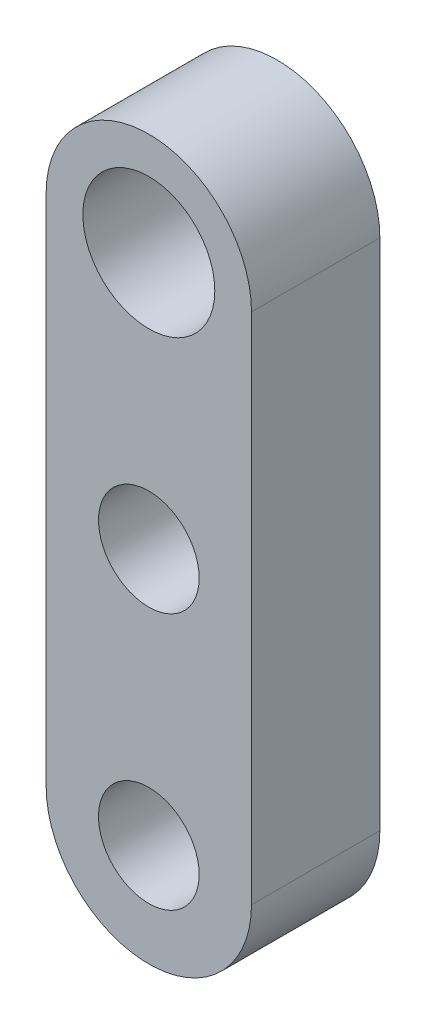
ISO-10303-21;
HEADER;
FILE_DESCRIPTION(('STEP AP214'),'2;1');
FILE_NAME('part.step','',(''),(''),'','','');
FILE_SCHEMA(('AUTOMOTIVE_DESIGN { 1 0 10303 214 1 1 1 1 }'));
ENDSEC;
DATA;
#1=APPLICATION_CONTEXT('core data for automotive mechanical design processes');
#2=APPLICATION_PROTOCOL_DEFINITION('international standard','automotive_design',2000,#1);
#3=PRODUCT_CONTEXT('',#1,'mechanical');
#4=PRODUCT('Part','Part','',(#3));
#5=PRODUCT_RELATED_PRODUCT_CATEGORY('part','',(#4));
#6=PRODUCT_DEFINITION_FORMATION('','',#4);
#7=PRODUCT_DEFINITION_CONTEXT('part definition',#1,'design');
#8=PRODUCT_DEFINITION('design','',#6,#7);
#9=PRODUCT_DEFINITION_SHAPE('','',#8);
#10=(LENGTH_UNIT() NAMED_UNIT(*) SI_UNIT(.MILLI.,.METRE.));
#11=(NAMED_UNIT(*) PLANE_ANGLE_UNIT() SI_UNIT($,.RADIAN.));
#12=(NAMED_UNIT(*) SI_UNIT($,.STERADIAN.) SOLID_ANGLE_UNIT());
#13=UNCERTAINTY_MEASURE_WITH_UNIT(LENGTH_MEASURE(1.E-05),#10,'distance_accuracy_value','');
#14=(GEOMETRIC_REPRESENTATION_CONTEXT(3) GLOBAL_UNCERTAINTY_ASSIGNED_CONTEXT((#13)) GLOBAL_UNIT_ASSIGNED_CONTEXT((#10,
#11,#12)) REPRESENTATION_CONTEXT('',''));
#15=CARTESIAN_POINT('',(0.,0.,0.));
#16=DIRECTION('',(0.,0.,1.));
#17=DIRECTION('',(1.,0.,0.));
#18=AXIS2_PLACEMENT_3D('',#15,#16,#17);
#19=CARTESIAN_POINT('',(60.6425000000078,0.,6.35));
#20=DIRECTION('',(-1.,0.,0.));
#21=DIRECTION('',(0.,-1.,0.));
#22=AXIS2_PLACEMENT_3D('',#19,#20,#21);
#23=PLANE('',#22);
#24=DIRECTION('',(0.,1.,0.));
#25=VECTOR('',#24,1.);
#26=CARTESIAN_POINT('',(60.6425000000078,0.,0.));
#27=LINE('',#26,#25);
#28=CARTESIAN_POINT('',(60.6425000000077,109.040413582038,0.));
#29=VERTEX_POINT('',#28);
#30=CARTESIAN_POINT('',(60.6425000000077,134.440413582038,0.));
#31=VERTEX_POINT('',#30);
#32=EDGE_CURVE('E123',#29,#31,#27,.T.);
#33=ORIENTED_EDGE('',*,*,#32,.T.);
#34=DIRECTION('',(0.,0.,-1.));
#35=VECTOR('',#34,1.);
#36=CARTESIAN_POINT('',(60.6425000000077,134.440413582038,6.35));
#37=LINE('',#36,#35);
#38=CARTESIAN_POINT('',(60.6425000000077,134.440413582038,6.35));
#39=VERTEX_POINT('',#38);
#40=EDGE_CURVE('E11',#39,#31,#37,.T.);
#41=ORIENTED_EDGE('',*,*,#40,.F.);
#42=DIRECTION('',(0.,1.,0.));
#43=VECTOR('',#42,1.);
#44=CARTESIAN_POINT('',(60.6425000000078,0.,6.35));
#45=LINE('',#44,#43);
#46=CARTESIAN_POINT('',(60.6425000000077,109.040413582038,6.35));
#47=VERTEX_POINT('',#46);
#48=EDGE_CURVE('E105',#47,#39,#45,.T.);
#49=ORIENTED_EDGE('',*,*,#48,.F.);
#50=DIRECTION('',(0.,0.,-1.));
#51=VECTOR('',#50,1.);
#52=CARTESIAN_POINT('',(60.6425000000077,109.040413582038,6.35));
#53=LINE('',#52,#51);
#54=EDGE_CURVE('E122',#47,#29,#53,.T.);
#55=ORIENTED_EDGE('',*,*,#54,.T.);
#56=EDGE_LOOP('',(#33,#41,#49,#55));
#57=FACE_BOUND('',#56,.T.);
#58=ADVANCED_FACE('F53',(#57),#23,.F.);
#59=CARTESIAN_POINT('',(55.5625000000077,134.440413582038,6.35));
#60=DIRECTION('',(0.,0.,-1.));
#61=DIRECTION('',(-1.,0.,0.));
#62=AXIS2_PLACEMENT_3D('',#59,#60,#61);
#63=CYLINDRICAL_SURFACE('',#62,5.08);
#64=CARTESIAN_POINT('',(55.5625000000077,134.440413582038,0.));
#65=DIRECTION('',(0.,0.,1.));
#66=DIRECTION('',(1.,0.,0.));
#67=AXIS2_PLACEMENT_3D('',#64,#65,#66);
#68=CIRCLE('',#67,5.08);
#69=CARTESIAN_POINT('',(50.4825000000077,134.440413582038,0.));
#70=VERTEX_POINT('',#69);
#71=EDGE_CURVE('E109',#31,#70,#68,.T.);
#72=ORIENTED_EDGE('',*,*,#71,.T.);
#73=DIRECTION('',(0.,0.,-1.));
#74=VECTOR('',#73,1.);
#75=CARTESIAN_POINT('',(50.4825000000077,134.440413582038,6.35));
#76=LINE('',#75,#74);
#77=CARTESIAN_POINT('',(50.4825000000077,134.440413582038,6.35));
#78=VERTEX_POINT('',#77);
#79=EDGE_CURVE('E61',#78,#70,#76,.T.);
#80=ORIENTED_EDGE('',*,*,#79,.F.);
#81=CARTESIAN_POINT('',(55.5625000000077,134.440413582038,6.35));
#82=DIRECTION('',(0.,0.,1.));
#83=DIRECTION('',(1.,0.,0.));
#84=AXIS2_PLACEMENT_3D('',#81,#82,#83);
#85=CIRCLE('',#84,5.08);
#86=EDGE_CURVE('E99',#39,#78,#85,.T.);
#87=ORIENTED_EDGE('',*,*,#86,.F.);
#88=ORIENTED_EDGE('',*,*,#40,.T.);
#89=EDGE_LOOP('',(#72,#80,#87,#88));
#90=FACE_BOUND('',#89,.T.);
#91=ADVANCED_FACE('F108',(#90),#63,.T.);
#92=CARTESIAN_POINT('',(50.4825000000077,0.,6.35));
#93=DIRECTION('',(1.,0.,0.));
#94=DIRECTION('',(0.,1.,0.));
#95=AXIS2_PLACEMENT_3D('',#92,#93,#94);
#96=PLANE('',#95);
#97=DIRECTION('',(0.,-1.,0.));
#98=VECTOR('',#97,1.);
#99=CARTESIAN_POINT('',(50.4825000000077,0.,0.));
#100=LINE('',#99,#98);
#101=CARTESIAN_POINT('',(50.4825000000077,109.040413582038,0.));
#102=VERTEX_POINT('',#101);
#103=EDGE_CURVE('E86',#70,#102,#100,.T.);
#104=ORIENTED_EDGE('',*,*,#103,.T.);
#105=DIRECTION('',(0.,0.,-1.));
#106=VECTOR('',#105,1.);
#107=CARTESIAN_POINT('',(50.4825000000077,109.040413582038,6.35));
#108=LINE('',#107,#106);
#109=CARTESIAN_POINT('',(50.4825000000077,109.040413582038,6.35));
#110=VERTEX_POINT('',#109);
#111=EDGE_CURVE('E110',#110,#102,#108,.T.);
#112=ORIENTED_EDGE('',*,*,#111,.F.);
#113=DIRECTION('',(0.,-1.,0.));
#114=VECTOR('',#113,1.);
#115=CARTESIAN_POINT('',(50.4825000000077,0.,6.35));
#116=LINE('',#115,#114);
#117=EDGE_CURVE('E103',#78,#110,#116,.T.);
#118=ORIENTED_EDGE('',*,*,#117,.F.);
#119=ORIENTED_EDGE('',*,*,#79,.T.);
#120=EDGE_LOOP('',(#104,#112,#118,#119));
#121=FACE_BOUND('',#120,.T.);
#122=ADVANCED_FACE('F111',(#121),#96,.F.);
#123=CARTESIAN_POINT('',(55.5625000000077,121.740413582038,6.35));
#124=DIRECTION('',(0.,0.,-1.));
#125=DIRECTION('',(-1.,0.,0.));
#126=AXIS2_PLACEMENT_3D('',#123,#124,#125);
#127=CYLINDRICAL_SURFACE('',#126,2.4892);
#128=CARTESIAN_POINT('',(55.5625000000077,121.740413582038,6.35));
#129=DIRECTION('',(0.,0.,1.));
#130=DIRECTION('',(1.,0.,0.));
#131=AXIS2_PLACEMENT_3D('',#128,#129,#130);
#132=CIRCLE('',#131,2.4892);
#133=CARTESIAN_POINT('',(58.0517000000077,121.740413582038,6.35));
#134=VERTEX_POINT('',#133);
#135=EDGE_CURVE('E113',#134,#134,#132,.T.);
#136=ORIENTED_EDGE('',*,*,#135,.T.);
#137=EDGE_LOOP('',(#136));
#138=FACE_BOUND('',#137,.T.);
#139=CARTESIAN_POINT('',(55.5625000000077,121.740413582038,0.));
#140=DIRECTION('',(0.,0.,1.));
#141=DIRECTION('',(1.,0.,0.));
#142=AXIS2_PLACEMENT_3D('',#139,#140,#141);
#143=CIRCLE('',#142,2.4892);
#144=CARTESIAN_POINT('',(58.0517000000077,121.740413582038,0.));
#145=VERTEX_POINT('',#144);
#146=EDGE_CURVE('E130',#145,#145,#143,.T.);
#147=ORIENTED_EDGE('',*,*,#146,.F.);
#148=EDGE_LOOP('',(#147));
#149=FACE_BOUND('',#148,.T.);
#150=ADVANCED_FACE('F173',(#138,#149),#127,.F.);
#151=CARTESIAN_POINT('',(55.5625000000077,109.040413582038,6.35));
#152=DIRECTION('',(0.,0.,-1.));
#153=DIRECTION('',(-1.,0.,0.));
#154=AXIS2_PLACEMENT_3D('',#151,#152,#153);
#155=CYLINDRICAL_SURFACE('',#154,5.08000000000001);
#156=CARTESIAN_POINT('',(55.5625000000077,109.040413582038,0.));
#157=DIRECTION('',(0.,0.,1.));
#158=DIRECTION('',(1.,0.,0.));
#159=AXIS2_PLACEMENT_3D('',#156,#157,#158);
#160=CIRCLE('',#159,5.08000000000001);
#161=EDGE_CURVE('E92',#102,#29,#160,.T.);
#162=ORIENTED_EDGE('',*,*,#161,.T.);
#163=ORIENTED_EDGE('',*,*,#54,.F.);
#164=CARTESIAN_POINT('',(55.5625000000077,109.040413582038,6.35));
#165=DIRECTION('',(0.,0.,1.));
#166=DIRECTION('',(1.,0.,0.));
#167=AXIS2_PLACEMENT_3D('',#164,#165,#166);
#168=CIRCLE('',#167,5.08000000000001);
#169=EDGE_CURVE('E69',#110,#47,#168,.T.);
#170=ORIENTED_EDGE('',*,*,#169,.F.);
#171=ORIENTED_EDGE('',*,*,#111,.T.);
#172=EDGE_LOOP('',(#162,#163,#170,#171));
#173=FACE_BOUND('',#172,.T.);
#174=ADVANCED_FACE('F137',(#173),#155,.T.);
#175=CARTESIAN_POINT('',(55.5625000000077,109.040413582038,6.35));
#176=DIRECTION('',(0.,0.,-1.));
#177=DIRECTION('',(-1.,0.,0.));
#178=AXIS2_PLACEMENT_3D('',#175,#176,#177);
#179=CYLINDRICAL_SURFACE('',#178,2.4892);
#180=CARTESIAN_POINT('',(55.5625000000077,109.040413582038,6.35));
#181=DIRECTION('',(0.,0.,1.));
#182=DIRECTION('',(1.,0.,0.));
#183=AXIS2_PLACEMENT_3D('',#180,#181,#182);
#184=CIRCLE('',#183,2.4892);
#185=CARTESIAN_POINT('',(58.0517000000077,109.040413582038,6.35));
#186=VERTEX_POINT('',#185);
#187=EDGE_CURVE('E119',#186,#186,#184,.T.);
#188=ORIENTED_EDGE('',*,*,#187,.T.);
#189=EDGE_LOOP('',(#188));
#190=FACE_BOUND('',#189,.T.);
#191=CARTESIAN_POINT('',(55.5625000000077,109.040413582038,0.));
#192=DIRECTION('',(0.,0.,1.));
#193=DIRECTION('',(1.,0.,0.));
#194=AXIS2_PLACEMENT_3D('',#191,#192,#193);
#195=CIRCLE('',#194,2.4892);
#196=CARTESIAN_POINT('',(58.0517000000077,109.040413582038,0.));
#197=VERTEX_POINT('',#196);
#198=EDGE_CURVE('E133',#197,#197,#195,.T.);
#199=ORIENTED_EDGE('',*,*,#198,.F.);
#200=EDGE_LOOP('',(#199));
#201=FACE_BOUND('',#200,.T.);
#202=ADVANCED_FACE('F153',(#190,#201),#179,.F.);
#203=CARTESIAN_POINT('',(0.,0.,6.35));
#204=DIRECTION('',(0.,0.,1.));
#205=DIRECTION('',(1.,0.,0.));
#206=AXIS2_PLACEMENT_3D('',#203,#204,#205);
#207=PLANE('',#206);
#208=CARTESIAN_POINT('',(55.5625000000077,134.440413582038,6.35));
#209=DIRECTION('',(0.,0.,1.));
#210=DIRECTION('',(1.,0.,0.));
#211=AXIS2_PLACEMENT_3D('',#208,#209,#210);
#212=CIRCLE('',#211,3.26389999999999);
#213=CARTESIAN_POINT('',(58.8264000000077,134.440413582038,6.35));
#214=VERTEX_POINT('',#213);
#215=EDGE_CURVE('E146',#214,#214,#212,.T.);
#216=ORIENTED_EDGE('',*,*,#215,.F.);
#217=EDGE_LOOP('',(#216));
#218=FACE_BOUND('',#217,.T.);
#219=ORIENTED_EDGE('',*,*,#48,.T.);
#220=ORIENTED_EDGE('',*,*,#86,.T.);
#221=ORIENTED_EDGE('',*,*,#117,.T.);
#222=ORIENTED_EDGE('',*,*,#169,.T.);
#223=EDGE_LOOP('',(#219,#220,#221,#222));
#224=FACE_BOUND('',#223,.T.);
#225=ORIENTED_EDGE('',*,*,#135,.F.);
#226=EDGE_LOOP('',(#225));
#227=FACE_BOUND('',#226,.T.);
#228=ORIENTED_EDGE('',*,*,#187,.F.);
#229=EDGE_LOOP('',(#228));
#230=FACE_BOUND('',#229,.T.);
#231=ADVANCED_FACE('F100',(#218,#224,#227,#230),#207,.T.);
#232=CARTESIAN_POINT('',(0.,0.,0.));
#233=DIRECTION('',(0.,0.,1.));
#234=DIRECTION('',(1.,0.,0.));
#235=AXIS2_PLACEMENT_3D('',#232,#233,#234);
#236=PLANE('',#235);
#237=CARTESIAN_POINT('',(55.5625000000077,134.440413582038,0.));
#238=DIRECTION('',(0.,0.,1.));
#239=DIRECTION('',(1.,0.,0.));
#240=AXIS2_PLACEMENT_3D('',#237,#238,#239);
#241=CIRCLE('',#240,3.2639);
#242=CARTESIAN_POINT('',(58.8264000000077,134.440413582038,0.));
#243=VERTEX_POINT('',#242);
#244=EDGE_CURVE('E126',#243,#243,#241,.T.);
#245=ORIENTED_EDGE('',*,*,#244,.T.);
#246=EDGE_LOOP('',(#245));
#247=FACE_BOUND('',#246,.T.);
#248=ORIENTED_EDGE('',*,*,#32,.F.);
#249=ORIENTED_EDGE('',*,*,#161,.F.);
#250=ORIENTED_EDGE('',*,*,#103,.F.);
#251=ORIENTED_EDGE('',*,*,#71,.F.);
#252=EDGE_LOOP('',(#248,#249,#250,#251));
#253=FACE_BOUND('',#252,.T.);
#254=ORIENTED_EDGE('',*,*,#146,.T.);
#255=EDGE_LOOP('',(#254));
#256=FACE_BOUND('',#255,.T.);
#257=ORIENTED_EDGE('',*,*,#198,.T.);
#258=EDGE_LOOP('',(#257));
#259=FACE_BOUND('',#258,.T.);
#260=ADVANCED_FACE('F140',(#247,#253,#256,#259),#236,.F.);
#261=CARTESIAN_POINT('',(55.5625000000077,134.440413582038,6.35));
#262=DIRECTION('',(0.,0.,1.));
#263=DIRECTION('',(1.,0.,0.));
#264=AXIS2_PLACEMENT_3D('',#261,#262,#263);
#265=CYLINDRICAL_SURFACE('',#264,3.26389999999999);
#266=ORIENTED_EDGE('',*,*,#244,.F.);
#267=EDGE_LOOP('',(#266));
#268=FACE_BOUND('',#267,.T.);
#269=ORIENTED_EDGE('',*,*,#215,.T.);
#270=EDGE_LOOP('',(#269));
#271=FACE_BOUND('',#270,.T.);
#272=ADVANCED_FACE('F150',(#268,#271),#265,.F.);
#273=CLOSED_SHELL('',(#58,#91,#122,#150,#174,#202,#231,#260,#272));
#274=MANIFOLD_SOLID_BREP('B2',#273);
#275=ADVANCED_BREP_SHAPE_REPRESENTATION('',(#18,#274),#14);
#276=SHAPE_DEFINITION_REPRESENTATION(#9,#275);
ENDSEC;
END-ISO-10303-21;
